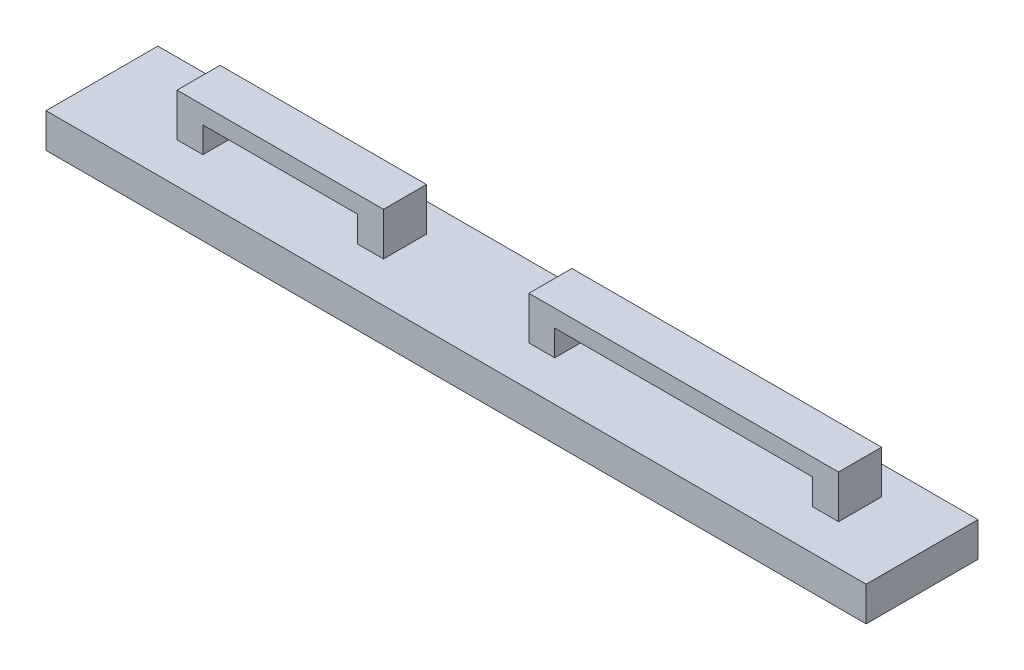
ISO-10303-21;
HEADER;
FILE_DESCRIPTION(('STEP AP214'),'2;1');
FILE_NAME('part.step','',(''),(''),'','','');
FILE_SCHEMA(('AUTOMOTIVE_DESIGN { 1 0 10303 214 1 1 1 1 }'));
ENDSEC;
DATA;
#1=APPLICATION_CONTEXT('core data for automotive mechanical design processes');
#2=APPLICATION_PROTOCOL_DEFINITION('international standard','automotive_design',2000,#1);
#3=PRODUCT_CONTEXT('',#1,'mechanical');
#4=PRODUCT('Part','Part','',(#3));
#5=PRODUCT_RELATED_PRODUCT_CATEGORY('part','',(#4));
#6=PRODUCT_DEFINITION_FORMATION('','',#4);
#7=PRODUCT_DEFINITION_CONTEXT('part definition',#1,'design');
#8=PRODUCT_DEFINITION('design','',#6,#7);
#9=PRODUCT_DEFINITION_SHAPE('','',#8);
#10=(LENGTH_UNIT() NAMED_UNIT(*) SI_UNIT(.MILLI.,.METRE.));
#11=(NAMED_UNIT(*) PLANE_ANGLE_UNIT() SI_UNIT($,.RADIAN.));
#12=(NAMED_UNIT(*) SI_UNIT($,.STERADIAN.) SOLID_ANGLE_UNIT());
#13=UNCERTAINTY_MEASURE_WITH_UNIT(LENGTH_MEASURE(1.E-05),#10,'distance_accuracy_value','');
#14=(GEOMETRIC_REPRESENTATION_CONTEXT(3) GLOBAL_UNCERTAINTY_ASSIGNED_CONTEXT((#13)) GLOBAL_UNIT_ASSIGNED_CONTEXT((#10,
#11,#12)) REPRESENTATION_CONTEXT('',''));
#15=CARTESIAN_POINT('',(0.,0.,0.));
#16=DIRECTION('',(0.,0.,1.));
#17=DIRECTION('',(1.,0.,0.));
#18=AXIS2_PLACEMENT_3D('',#15,#16,#17);
#19=CARTESIAN_POINT('',(0.,2.,0.));
#20=DIRECTION('',(0.,1.,0.));
#21=DIRECTION('',(0.,0.,1.));
#22=AXIS2_PLACEMENT_3D('',#19,#20,#21);
#23=PLANE('',#22);
#24=DIRECTION('',(1.,0.,0.));
#25=VECTOR('',#24,1.);
#26=CARTESIAN_POINT('',(-23.8392418824722,2.,0.));
#27=LINE('',#26,#25);
#28=CARTESIAN_POINT('',(-23.8392418824722,2.,0.));
#29=VERTEX_POINT('',#28);
#30=CARTESIAN_POINT('',(23.8392418824722,2.,0.));
#31=VERTEX_POINT('',#30);
#32=EDGE_CURVE('E180',#29,#31,#27,.T.);
#33=ORIENTED_EDGE('',*,*,#32,.F.);
#34=DIRECTION('',(0.,0.,1.));
#35=VECTOR('',#34,1.);
#36=CARTESIAN_POINT('',(-23.8392418824722,2.,-6.50216160924183));
#37=LINE('',#36,#35);
#38=CARTESIAN_POINT('',(-23.8392418824722,2.,6.50216160924183));
#39=VERTEX_POINT('',#38);
#40=EDGE_CURVE('E187',#29,#39,#37,.T.);
#41=ORIENTED_EDGE('',*,*,#40,.T.);
#42=DIRECTION('',(1.,0.,0.));
#43=VECTOR('',#42,1.);
#44=CARTESIAN_POINT('',(-23.8392418824722,2.,6.50216160924183));
#45=LINE('',#44,#43);
#46=CARTESIAN_POINT('',(23.8392418824722,2.,6.50216160924183));
#47=VERTEX_POINT('',#46);
#48=EDGE_CURVE('E200',#39,#47,#45,.T.);
#49=ORIENTED_EDGE('',*,*,#48,.T.);
#50=DIRECTION('',(0.,0.,-1.));
#51=VECTOR('',#50,1.);
#52=CARTESIAN_POINT('',(23.8392418824722,2.,-6.50216160924183));
#53=LINE('',#52,#51);
#54=EDGE_CURVE('E194',#47,#31,#53,.T.);
#55=ORIENTED_EDGE('',*,*,#54,.T.);
#56=EDGE_LOOP('',(#33,#41,#49,#55));
#57=FACE_BOUND('',#56,.T.);
#58=DIRECTION('',(-1.,0.,0.));
#59=VECTOR('',#58,1.);
#60=CARTESIAN_POINT('',(-18.5640283455676,2.,1.65860922456916));
#61=LINE('',#60,#59);
#62=CARTESIAN_POINT('',(-17.0640283455676,2.,1.65860922456916));
#63=VERTEX_POINT('',#62);
#64=CARTESIAN_POINT('',(-18.5640283455676,2.,1.65860922456916));
#65=VERTEX_POINT('',#64);
#66=EDGE_CURVE('E225',#63,#65,#61,.T.);
#67=ORIENTED_EDGE('',*,*,#66,.F.);
#68=DIRECTION('',(0.,0.,-1.));
#69=VECTOR('',#68,1.);
#70=CARTESIAN_POINT('',(-17.0640283455676,2.,1.65860922456916));
#71=LINE('',#70,#69);
#72=CARTESIAN_POINT('',(-17.0640283455676,2.,4.15860922456916));
#73=VERTEX_POINT('',#72);
#74=EDGE_CURVE('E227',#73,#63,#71,.T.);
#75=ORIENTED_EDGE('',*,*,#74,.F.);
#76=DIRECTION('',(1.,0.,0.));
#77=VECTOR('',#76,1.);
#78=CARTESIAN_POINT('',(-18.5640283455676,2.,4.15860922456916));
#79=LINE('',#78,#77);
#80=CARTESIAN_POINT('',(-18.5640283455676,2.,4.15860922456916));
#81=VERTEX_POINT('',#80);
#82=EDGE_CURVE('E220',#81,#73,#79,.T.);
#83=ORIENTED_EDGE('',*,*,#82,.F.);
#84=DIRECTION('',(0.,0.,1.));
#85=VECTOR('',#84,1.);
#86=CARTESIAN_POINT('',(-18.5640283455676,2.,1.65860922456916));
#87=LINE('',#86,#85);
#88=EDGE_CURVE('E222',#65,#81,#87,.T.);
#89=ORIENTED_EDGE('',*,*,#88,.F.);
#90=EDGE_LOOP('',(#67,#75,#83,#89));
#91=FACE_BOUND('',#90,.T.);
#92=DIRECTION('',(1.,0.,0.));
#93=VECTOR('',#92,1.);
#94=CARTESIAN_POINT('',(-8.06402834556756,2.,4.15860922456916));
#95=LINE('',#94,#93);
#96=CARTESIAN_POINT('',(-8.06402834556756,2.,4.15860922456916));
#97=VERTEX_POINT('',#96);
#98=CARTESIAN_POINT('',(-6.56402834556753,2.,4.15860922456916));
#99=VERTEX_POINT('',#98);
#100=EDGE_CURVE('E240',#97,#99,#95,.T.);
#101=ORIENTED_EDGE('',*,*,#100,.F.);
#102=DIRECTION('',(0.,0.,1.));
#103=VECTOR('',#102,1.);
#104=CARTESIAN_POINT('',(-8.06402834556756,2.,1.65860922456916));
#105=LINE('',#104,#103);
#106=CARTESIAN_POINT('',(-8.06402834556756,2.,1.65860922456916));
#107=VERTEX_POINT('',#106);
#108=EDGE_CURVE('E230',#107,#97,#105,.T.);
#109=ORIENTED_EDGE('',*,*,#108,.F.);
#110=DIRECTION('',(-1.,0.,0.));
#111=VECTOR('',#110,1.);
#112=CARTESIAN_POINT('',(-8.06402834556756,2.,1.65860922456916));
#113=LINE('',#112,#111);
#114=CARTESIAN_POINT('',(-6.56402834556756,2.,1.65860922456916));
#115=VERTEX_POINT('',#114);
#116=EDGE_CURVE('E236',#115,#107,#113,.T.);
#117=ORIENTED_EDGE('',*,*,#116,.F.);
#118=DIRECTION('',(0.,0.,-1.));
#119=VECTOR('',#118,1.);
#120=CARTESIAN_POINT('',(-6.56402834556756,2.,1.65860922456916));
#121=LINE('',#120,#119);
#122=EDGE_CURVE('E242',#99,#115,#121,.T.);
#123=ORIENTED_EDGE('',*,*,#122,.F.);
#124=EDGE_LOOP('',(#101,#109,#117,#123));
#125=FACE_BOUND('',#124,.T.);
#126=DIRECTION('',(1.,0.,0.));
#127=VECTOR('',#126,1.);
#128=CARTESIAN_POINT('',(1.89101271490993,2.,4.15860922456916));
#129=LINE('',#128,#127);
#130=CARTESIAN_POINT('',(1.89101271490993,2.,4.15860922456916));
#131=VERTEX_POINT('',#130);
#132=CARTESIAN_POINT('',(3.39101271490993,2.,4.15860922456916));
#133=VERTEX_POINT('',#132);
#134=EDGE_CURVE('E263',#131,#133,#129,.T.);
#135=ORIENTED_EDGE('',*,*,#134,.F.);
#136=DIRECTION('',(0.,0.,1.));
#137=VECTOR('',#136,1.);
#138=CARTESIAN_POINT('',(1.89101271490993,2.,1.65860922456916));
#139=LINE('',#138,#137);
#140=CARTESIAN_POINT('',(1.89101271490993,2.,1.65860922456916));
#141=VERTEX_POINT('',#140);
#142=EDGE_CURVE('E255',#141,#131,#139,.T.);
#143=ORIENTED_EDGE('',*,*,#142,.F.);
#144=DIRECTION('',(-1.,0.,0.));
#145=VECTOR('',#144,1.);
#146=CARTESIAN_POINT('',(1.89101271490993,2.,1.65860922456916));
#147=LINE('',#146,#145);
#148=CARTESIAN_POINT('',(3.39101271490993,2.,1.65860922456916));
#149=VERTEX_POINT('',#148);
#150=EDGE_CURVE('E259',#149,#141,#147,.T.);
#151=ORIENTED_EDGE('',*,*,#150,.F.);
#152=DIRECTION('',(0.,0.,-1.));
#153=VECTOR('',#152,1.);
#154=CARTESIAN_POINT('',(3.39101271490993,2.,1.65860922456916));
#155=LINE('',#154,#153);
#156=EDGE_CURVE('E265',#133,#149,#155,.T.);
#157=ORIENTED_EDGE('',*,*,#156,.F.);
#158=EDGE_LOOP('',(#135,#143,#151,#157));
#159=FACE_BOUND('',#158,.T.);
#160=DIRECTION('',(1.,0.,0.));
#161=VECTOR('',#160,1.);
#162=CARTESIAN_POINT('',(18.3910127149099,2.,4.15860922456916));
#163=LINE('',#162,#161);
#164=CARTESIAN_POINT('',(18.3910127149099,2.,4.15860922456916));
#165=VERTEX_POINT('',#164);
#166=CARTESIAN_POINT('',(19.8910127149099,2.,4.15860922456916));
#167=VERTEX_POINT('',#166);
#168=EDGE_CURVE('E286',#165,#167,#163,.T.);
#169=ORIENTED_EDGE('',*,*,#168,.F.);
#170=DIRECTION('',(0.,0.,1.));
#171=VECTOR('',#170,1.);
#172=CARTESIAN_POINT('',(18.3910127149099,2.,1.65860922456916));
#173=LINE('',#172,#171);
#174=CARTESIAN_POINT('',(18.3910127149099,2.,1.65860922456916));
#175=VERTEX_POINT('',#174);
#176=EDGE_CURVE('E278',#175,#165,#173,.T.);
#177=ORIENTED_EDGE('',*,*,#176,.F.);
#178=DIRECTION('',(-1.,0.,0.));
#179=VECTOR('',#178,1.);
#180=CARTESIAN_POINT('',(18.3910127149099,2.,1.65860922456916));
#181=LINE('',#180,#179);
#182=CARTESIAN_POINT('',(19.8910127149099,2.,1.65860922456916));
#183=VERTEX_POINT('',#182);
#184=EDGE_CURVE('E282',#183,#175,#181,.T.);
#185=ORIENTED_EDGE('',*,*,#184,.F.);
#186=DIRECTION('',(0.,0.,-1.));
#187=VECTOR('',#186,1.);
#188=CARTESIAN_POINT('',(19.8910127149099,2.,1.65860922456916));
#189=LINE('',#188,#187);
#190=EDGE_CURVE('E288',#167,#183,#189,.T.);
#191=ORIENTED_EDGE('',*,*,#190,.F.);
#192=EDGE_LOOP('',(#169,#177,#185,#191));
#193=FACE_BOUND('',#192,.T.);
#194=ADVANCED_FACE('F37',(#57,#91,#125,#159,#193),#23,.T.);
#195=CARTESIAN_POINT('',(23.8392418824722,2.,-6.50216160924183));
#196=DIRECTION('',(-1.,0.,0.));
#197=DIRECTION('',(0.,0.,1.));
#198=AXIS2_PLACEMENT_3D('',#195,#196,#197);
#199=PLANE('',#198);
#200=DIRECTION('',(0.,0.,-1.));
#201=VECTOR('',#200,1.);
#202=CARTESIAN_POINT('',(23.8392418824722,0.,-6.50216160924183));
#203=LINE('',#202,#201);
#204=CARTESIAN_POINT('',(23.8392418824722,0.,6.50216160924183));
#205=VERTEX_POINT('',#204);
#206=CARTESIAN_POINT('',(23.8392418824722,0.,0.));
#207=VERTEX_POINT('',#206);
#208=EDGE_CURVE('E192',#205,#207,#203,.T.);
#209=ORIENTED_EDGE('',*,*,#208,.T.);
#210=DIRECTION('',(0.,1.,0.));
#211=VECTOR('',#210,1.);
#212=CARTESIAN_POINT('',(23.8392418824722,0.,0.));
#213=LINE('',#212,#211);
#214=EDGE_CURVE('E52',#207,#31,#213,.T.);
#215=ORIENTED_EDGE('',*,*,#214,.T.);
#216=ORIENTED_EDGE('',*,*,#54,.F.);
#217=DIRECTION('',(0.,-1.,0.));
#218=VECTOR('',#217,1.);
#219=CARTESIAN_POINT('',(23.8392418824722,2.,6.50216160924183));
#220=LINE('',#219,#218);
#221=EDGE_CURVE('E45',#47,#205,#220,.T.);
#222=ORIENTED_EDGE('',*,*,#221,.T.);
#223=EDGE_LOOP('',(#209,#215,#216,#222));
#224=FACE_BOUND('',#223,.T.);
#225=ADVANCED_FACE('F39',(#224),#199,.F.);
#226=CARTESIAN_POINT('',(-23.8392418824722,2.,-6.50216160924183));
#227=DIRECTION('',(1.,0.,0.));
#228=DIRECTION('',(0.,0.,-1.));
#229=AXIS2_PLACEMENT_3D('',#226,#227,#228);
#230=PLANE('',#229);
#231=ORIENTED_EDGE('',*,*,#40,.F.);
#232=DIRECTION('',(0.,1.,0.));
#233=VECTOR('',#232,1.);
#234=CARTESIAN_POINT('',(-23.8392418824722,0.,0.));
#235=LINE('',#234,#233);
#236=CARTESIAN_POINT('',(-23.8392418824722,0.,0.));
#237=VERTEX_POINT('',#236);
#238=EDGE_CURVE('E174',#237,#29,#235,.T.);
#239=ORIENTED_EDGE('',*,*,#238,.F.);
#240=DIRECTION('',(0.,0.,1.));
#241=VECTOR('',#240,1.);
#242=CARTESIAN_POINT('',(-23.8392418824722,0.,-6.50216160924183));
#243=LINE('',#242,#241);
#244=CARTESIAN_POINT('',(-23.8392418824722,0.,6.50216160924183));
#245=VERTEX_POINT('',#244);
#246=EDGE_CURVE('E186',#237,#245,#243,.T.);
#247=ORIENTED_EDGE('',*,*,#246,.T.);
#248=DIRECTION('',(0.,-1.,0.));
#249=VECTOR('',#248,1.);
#250=CARTESIAN_POINT('',(-23.8392418824722,2.,6.50216160924183));
#251=LINE('',#250,#249);
#252=EDGE_CURVE('E11',#39,#245,#251,.T.);
#253=ORIENTED_EDGE('',*,*,#252,.F.);
#254=EDGE_LOOP('',(#231,#239,#247,#253));
#255=FACE_BOUND('',#254,.T.);
#256=ADVANCED_FACE('F184',(#255),#230,.F.);
#257=CARTESIAN_POINT('',(-23.8392418824722,2.,6.50216160924183));
#258=DIRECTION('',(0.,0.,-1.));
#259=DIRECTION('',(-1.,0.,0.));
#260=AXIS2_PLACEMENT_3D('',#257,#258,#259);
#261=PLANE('',#260);
#262=DIRECTION('',(1.,0.,0.));
#263=VECTOR('',#262,1.);
#264=CARTESIAN_POINT('',(-23.8392418824722,0.,6.50216160924183));
#265=LINE('',#264,#263);
#266=EDGE_CURVE('E191',#245,#205,#265,.T.);
#267=ORIENTED_EDGE('',*,*,#266,.T.);
#268=ORIENTED_EDGE('',*,*,#221,.F.);
#269=ORIENTED_EDGE('',*,*,#48,.F.);
#270=ORIENTED_EDGE('',*,*,#252,.T.);
#271=EDGE_LOOP('',(#267,#268,#269,#270));
#272=FACE_BOUND('',#271,.T.);
#273=ADVANCED_FACE('F422',(#272),#261,.F.);
#274=CARTESIAN_POINT('',(0.,0.,0.));
#275=DIRECTION('',(0.,1.,0.));
#276=DIRECTION('',(0.,0.,1.));
#277=AXIS2_PLACEMENT_3D('',#274,#275,#276);
#278=PLANE('',#277);
#279=ORIENTED_EDGE('',*,*,#246,.F.);
#280=DIRECTION('',(1.,0.,0.));
#281=VECTOR('',#280,1.);
#282=CARTESIAN_POINT('',(-23.8392418824722,0.,0.));
#283=LINE('',#282,#281);
#284=EDGE_CURVE('E171',#237,#207,#283,.T.);
#285=ORIENTED_EDGE('',*,*,#284,.T.);
#286=ORIENTED_EDGE('',*,*,#208,.F.);
#287=ORIENTED_EDGE('',*,*,#266,.F.);
#288=EDGE_LOOP('',(#279,#285,#286,#287));
#289=FACE_BOUND('',#288,.T.);
#290=ADVANCED_FACE('F190',(#289),#278,.F.);
#291=CARTESIAN_POINT('',(-17.0640283455676,3.5,1.65860922456916));
#292=DIRECTION('',(-1.,0.,0.));
#293=DIRECTION('',(0.,0.,1.));
#294=AXIS2_PLACEMENT_3D('',#291,#292,#293);
#295=PLANE('',#294);
#296=ORIENTED_EDGE('',*,*,#74,.T.);
#297=DIRECTION('',(0.,-1.,0.));
#298=VECTOR('',#297,1.);
#299=CARTESIAN_POINT('',(-17.0640283455676,3.5,1.65860922456916));
#300=LINE('',#299,#298);
#301=CARTESIAN_POINT('',(-17.0640283455676,3.5,1.65860922456916));
#302=VERTEX_POINT('',#301);
#303=EDGE_CURVE('E196',#302,#63,#300,.T.);
#304=ORIENTED_EDGE('',*,*,#303,.F.);
#305=DIRECTION('',(0.,0.,-1.));
#306=VECTOR('',#305,1.);
#307=CARTESIAN_POINT('',(-17.0640283455676,3.5,1.65860922456916));
#308=LINE('',#307,#306);
#309=CARTESIAN_POINT('',(-17.0640283455676,3.5,4.15860922456916));
#310=VERTEX_POINT('',#309);
#311=EDGE_CURVE('E219',#310,#302,#308,.T.);
#312=ORIENTED_EDGE('',*,*,#311,.F.);
#313=DIRECTION('',(0.,-1.,0.));
#314=VECTOR('',#313,1.);
#315=CARTESIAN_POINT('',(-17.0640283455676,3.5,4.15860922456916));
#316=LINE('',#315,#314);
#317=EDGE_CURVE('E216',#310,#73,#316,.T.);
#318=ORIENTED_EDGE('',*,*,#317,.T.);
#319=EDGE_LOOP('',(#296,#304,#312,#318));
#320=FACE_BOUND('',#319,.T.);
#321=ADVANCED_FACE('F415',(#320),#295,.F.);
#322=CARTESIAN_POINT('',(-18.5640283455676,3.5,1.65860922456916));
#323=DIRECTION('',(0.,0.,1.));
#324=DIRECTION('',(1.,0.,0.));
#325=AXIS2_PLACEMENT_3D('',#322,#323,#324);
#326=PLANE('',#325);
#327=ORIENTED_EDGE('',*,*,#66,.T.);
#328=DIRECTION('',(0.,-1.,0.));
#329=VECTOR('',#328,1.);
#330=CARTESIAN_POINT('',(-18.5640283455676,3.5,1.65860922456916));
#331=LINE('',#330,#329);
#332=CARTESIAN_POINT('',(-18.5640283455676,4.5,1.65860922456916));
#333=VERTEX_POINT('',#332);
#334=EDGE_CURVE('E211',#333,#65,#331,.T.);
#335=ORIENTED_EDGE('',*,*,#334,.F.);
#336=DIRECTION('',(-1.,0.,0.));
#337=VECTOR('',#336,1.);
#338=CARTESIAN_POINT('',(-18.5640283455676,4.5,1.65860922456916));
#339=LINE('',#338,#337);
#340=CARTESIAN_POINT('',(-6.56402834556753,4.5,1.65860922456916));
#341=VERTEX_POINT('',#340);
#342=EDGE_CURVE('E299',#341,#333,#339,.T.);
#343=ORIENTED_EDGE('',*,*,#342,.F.);
#344=DIRECTION('',(0.,-1.,0.));
#345=VECTOR('',#344,1.);
#346=CARTESIAN_POINT('',(-6.56402834556756,3.5,1.65860922456916));
#347=LINE('',#346,#345);
#348=EDGE_CURVE('E248',#341,#115,#347,.T.);
#349=ORIENTED_EDGE('',*,*,#348,.T.);
#350=ORIENTED_EDGE('',*,*,#116,.T.);
#351=DIRECTION('',(0.,-1.,0.));
#352=VECTOR('',#351,1.);
#353=CARTESIAN_POINT('',(-8.06402834556756,3.5,1.65860922456916));
#354=LINE('',#353,#352);
#355=CARTESIAN_POINT('',(-8.06402834556756,3.5,1.65860922456916));
#356=VERTEX_POINT('',#355);
#357=EDGE_CURVE('E237',#356,#107,#354,.T.);
#358=ORIENTED_EDGE('',*,*,#357,.F.);
#359=DIRECTION('',(-1.,0.,0.));
#360=VECTOR('',#359,1.);
#361=CARTESIAN_POINT('',(-18.5640283455676,3.5,1.65860922456916));
#362=LINE('',#361,#360);
#363=EDGE_CURVE('E300',#356,#302,#362,.T.);
#364=ORIENTED_EDGE('',*,*,#363,.T.);
#365=ORIENTED_EDGE('',*,*,#303,.T.);
#366=EDGE_LOOP('',(#327,#335,#343,#349,#350,#358,#364,#365));
#367=FACE_BOUND('',#366,.T.);
#368=ADVANCED_FACE('F411',(#367),#326,.F.);
#369=CARTESIAN_POINT('',(-18.5640283455676,3.5,1.65860922456916));
#370=DIRECTION('',(1.,0.,0.));
#371=DIRECTION('',(0.,0.,-1.));
#372=AXIS2_PLACEMENT_3D('',#369,#370,#371);
#373=PLANE('',#372);
#374=ORIENTED_EDGE('',*,*,#88,.T.);
#375=DIRECTION('',(0.,-1.,0.));
#376=VECTOR('',#375,1.);
#377=CARTESIAN_POINT('',(-18.5640283455676,3.5,4.15860922456916));
#378=LINE('',#377,#376);
#379=CARTESIAN_POINT('',(-18.5640283455676,4.5,4.15860922456916));
#380=VERTEX_POINT('',#379);
#381=EDGE_CURVE('E214',#380,#81,#378,.T.);
#382=ORIENTED_EDGE('',*,*,#381,.F.);
#383=DIRECTION('',(0.,0.,1.));
#384=VECTOR('',#383,1.);
#385=CARTESIAN_POINT('',(-18.5640283455676,4.5,1.65860922456916));
#386=LINE('',#385,#384);
#387=EDGE_CURVE('E303',#333,#380,#386,.T.);
#388=ORIENTED_EDGE('',*,*,#387,.F.);
#389=ORIENTED_EDGE('',*,*,#334,.T.);
#390=EDGE_LOOP('',(#374,#382,#388,#389));
#391=FACE_BOUND('',#390,.T.);
#392=ADVANCED_FACE('F407',(#391),#373,.F.);
#393=CARTESIAN_POINT('',(-18.5640283455676,3.5,4.15860922456916));
#394=DIRECTION('',(0.,0.,-1.));
#395=DIRECTION('',(-1.,0.,0.));
#396=AXIS2_PLACEMENT_3D('',#393,#394,#395);
#397=PLANE('',#396);
#398=ORIENTED_EDGE('',*,*,#82,.T.);
#399=ORIENTED_EDGE('',*,*,#317,.F.);
#400=DIRECTION('',(1.,0.,0.));
#401=VECTOR('',#400,1.);
#402=CARTESIAN_POINT('',(-18.5640283455676,3.5,4.15860922456916));
#403=LINE('',#402,#401);
#404=CARTESIAN_POINT('',(-8.06402834556756,3.5,4.15860922456916));
#405=VERTEX_POINT('',#404);
#406=EDGE_CURVE('E304',#310,#405,#403,.T.);
#407=ORIENTED_EDGE('',*,*,#406,.T.);
#408=DIRECTION('',(0.,-1.,0.));
#409=VECTOR('',#408,1.);
#410=CARTESIAN_POINT('',(-8.06402834556756,3.5,4.15860922456916));
#411=LINE('',#410,#409);
#412=EDGE_CURVE('E253',#405,#97,#411,.T.);
#413=ORIENTED_EDGE('',*,*,#412,.T.);
#414=ORIENTED_EDGE('',*,*,#100,.T.);
#415=DIRECTION('',(0.,-1.,0.));
#416=VECTOR('',#415,1.);
#417=CARTESIAN_POINT('',(-6.56402834556753,3.5,4.15860922456916));
#418=LINE('',#417,#416);
#419=CARTESIAN_POINT('',(-6.56402834556753,4.5,4.15860922456916));
#420=VERTEX_POINT('',#419);
#421=EDGE_CURVE('E250',#420,#99,#418,.T.);
#422=ORIENTED_EDGE('',*,*,#421,.F.);
#423=DIRECTION('',(1.,0.,0.));
#424=VECTOR('',#423,1.);
#425=CARTESIAN_POINT('',(-18.5640283455676,4.5,4.15860922456916));
#426=LINE('',#425,#424);
#427=EDGE_CURVE('E313',#380,#420,#426,.T.);
#428=ORIENTED_EDGE('',*,*,#427,.F.);
#429=ORIENTED_EDGE('',*,*,#381,.T.);
#430=EDGE_LOOP('',(#398,#399,#407,#413,#414,#422,#428,#429));
#431=FACE_BOUND('',#430,.T.);
#432=ADVANCED_FACE('F400',(#431),#397,.F.);
#433=CARTESIAN_POINT('',(-8.06402834556756,3.5,1.65860922456916));
#434=DIRECTION('',(1.,0.,0.));
#435=DIRECTION('',(0.,0.,-1.));
#436=AXIS2_PLACEMENT_3D('',#433,#434,#435);
#437=PLANE('',#436);
#438=ORIENTED_EDGE('',*,*,#108,.T.);
#439=ORIENTED_EDGE('',*,*,#412,.F.);
#440=DIRECTION('',(0.,0.,1.));
#441=VECTOR('',#440,1.);
#442=CARTESIAN_POINT('',(-8.06402834556756,3.5,1.65860922456916));
#443=LINE('',#442,#441);
#444=EDGE_CURVE('E233',#356,#405,#443,.T.);
#445=ORIENTED_EDGE('',*,*,#444,.F.);
#446=ORIENTED_EDGE('',*,*,#357,.T.);
#447=EDGE_LOOP('',(#438,#439,#445,#446));
#448=FACE_BOUND('',#447,.T.);
#449=ADVANCED_FACE('F397',(#448),#437,.F.);
#450=CARTESIAN_POINT('',(-6.56402834556756,3.5,1.65860922456916));
#451=DIRECTION('',(-1.,0.,0.));
#452=DIRECTION('',(0.,0.,1.));
#453=AXIS2_PLACEMENT_3D('',#450,#451,#452);
#454=PLANE('',#453);
#455=ORIENTED_EDGE('',*,*,#122,.T.);
#456=ORIENTED_EDGE('',*,*,#348,.F.);
#457=DIRECTION('',(0.,0.,-1.));
#458=VECTOR('',#457,1.);
#459=CARTESIAN_POINT('',(-6.56402834556753,4.5,1.65860922456916));
#460=LINE('',#459,#458);
#461=EDGE_CURVE('E310',#420,#341,#460,.T.);
#462=ORIENTED_EDGE('',*,*,#461,.F.);
#463=ORIENTED_EDGE('',*,*,#421,.T.);
#464=EDGE_LOOP('',(#455,#456,#462,#463));
#465=FACE_BOUND('',#464,.T.);
#466=ADVANCED_FACE('F392',(#465),#454,.F.);
#467=CARTESIAN_POINT('',(1.89101271490993,3.5,1.65860922456916));
#468=DIRECTION('',(1.,0.,0.));
#469=DIRECTION('',(0.,0.,-1.));
#470=AXIS2_PLACEMENT_3D('',#467,#468,#469);
#471=PLANE('',#470);
#472=ORIENTED_EDGE('',*,*,#142,.T.);
#473=DIRECTION('',(0.,-1.,0.));
#474=VECTOR('',#473,1.);
#475=CARTESIAN_POINT('',(1.89101271490993,3.5,4.15860922456916));
#476=LINE('',#475,#474);
#477=CARTESIAN_POINT('',(1.89101271490993,4.5,4.15860922456916));
#478=VERTEX_POINT('',#477);
#479=EDGE_CURVE('E276',#478,#131,#476,.T.);
#480=ORIENTED_EDGE('',*,*,#479,.F.);
#481=DIRECTION('',(0.,0.,1.));
#482=VECTOR('',#481,1.);
#483=CARTESIAN_POINT('',(1.89101271490993,4.5,1.65860922456916));
#484=LINE('',#483,#482);
#485=CARTESIAN_POINT('',(1.89101271490993,4.5,1.65860922456916));
#486=VERTEX_POINT('',#485);
#487=EDGE_CURVE('E318',#486,#478,#484,.T.);
#488=ORIENTED_EDGE('',*,*,#487,.F.);
#489=DIRECTION('',(0.,-1.,0.));
#490=VECTOR('',#489,1.);
#491=CARTESIAN_POINT('',(1.89101271490993,3.5,1.65860922456916));
#492=LINE('',#491,#490);
#493=EDGE_CURVE('E260',#486,#141,#492,.T.);
#494=ORIENTED_EDGE('',*,*,#493,.T.);
#495=EDGE_LOOP('',(#472,#480,#488,#494));
#496=FACE_BOUND('',#495,.T.);
#497=ADVANCED_FACE('F367',(#496),#471,.F.);
#498=CARTESIAN_POINT('',(1.89101271490993,3.5,4.15860922456916));
#499=DIRECTION('',(0.,0.,-1.));
#500=DIRECTION('',(-1.,0.,0.));
#501=AXIS2_PLACEMENT_3D('',#498,#499,#500);
#502=PLANE('',#501);
#503=ORIENTED_EDGE('',*,*,#134,.T.);
#504=DIRECTION('',(0.,-1.,0.));
#505=VECTOR('',#504,1.);
#506=CARTESIAN_POINT('',(3.39101271490993,3.5,4.15860922456916));
#507=LINE('',#506,#505);
#508=CARTESIAN_POINT('',(3.39101271490993,3.5,4.15860922456916));
#509=VERTEX_POINT('',#508);
#510=EDGE_CURVE('E273',#509,#133,#507,.T.);
#511=ORIENTED_EDGE('',*,*,#510,.F.);
#512=DIRECTION('',(1.,0.,0.));
#513=VECTOR('',#512,1.);
#514=CARTESIAN_POINT('',(1.89101271490993,3.5,4.15860922456916));
#515=LINE('',#514,#513);
#516=CARTESIAN_POINT('',(18.3910127149099,3.5,4.15860922456916));
#517=VERTEX_POINT('',#516);
#518=EDGE_CURVE('E307',#509,#517,#515,.T.);
#519=ORIENTED_EDGE('',*,*,#518,.T.);
#520=DIRECTION('',(0.,-1.,0.));
#521=VECTOR('',#520,1.);
#522=CARTESIAN_POINT('',(18.3910127149099,3.5,4.15860922456916));
#523=LINE('',#522,#521);
#524=EDGE_CURVE('E297',#517,#165,#523,.T.);
#525=ORIENTED_EDGE('',*,*,#524,.T.);
#526=ORIENTED_EDGE('',*,*,#168,.T.);
#527=DIRECTION('',(0.,-1.,0.));
#528=VECTOR('',#527,1.);
#529=CARTESIAN_POINT('',(19.8910127149099,3.5,4.15860922456916));
#530=LINE('',#529,#528);
#531=CARTESIAN_POINT('',(19.8910127149099,4.5,4.15860922456916));
#532=VERTEX_POINT('',#531);
#533=EDGE_CURVE('E294',#532,#167,#530,.T.);
#534=ORIENTED_EDGE('',*,*,#533,.F.);
#535=DIRECTION('',(1.,0.,0.));
#536=VECTOR('',#535,1.);
#537=CARTESIAN_POINT('',(1.89101271490993,4.5,4.15860922456916));
#538=LINE('',#537,#536);
#539=EDGE_CURVE('E322',#478,#532,#538,.T.);
#540=ORIENTED_EDGE('',*,*,#539,.F.);
#541=ORIENTED_EDGE('',*,*,#479,.T.);
#542=EDGE_LOOP('',(#503,#511,#519,#525,#526,#534,#540,#541));
#543=FACE_BOUND('',#542,.T.);
#544=ADVANCED_FACE('F356',(#543),#502,.F.);
#545=CARTESIAN_POINT('',(3.39101271490993,3.5,1.65860922456916));
#546=DIRECTION('',(-1.,0.,0.));
#547=DIRECTION('',(0.,0.,1.));
#548=AXIS2_PLACEMENT_3D('',#545,#546,#547);
#549=PLANE('',#548);
#550=ORIENTED_EDGE('',*,*,#156,.T.);
#551=DIRECTION('',(0.,-1.,0.));
#552=VECTOR('',#551,1.);
#553=CARTESIAN_POINT('',(3.39101271490993,3.5,1.65860922456916));
#554=LINE('',#553,#552);
#555=CARTESIAN_POINT('',(3.39101271490993,3.5,1.65860922456916));
#556=VERTEX_POINT('',#555);
#557=EDGE_CURVE('E271',#556,#149,#554,.T.);
#558=ORIENTED_EDGE('',*,*,#557,.F.);
#559=DIRECTION('',(0.,0.,-1.));
#560=VECTOR('',#559,1.);
#561=CARTESIAN_POINT('',(3.39101271490993,3.5,1.65860922456916));
#562=LINE('',#561,#560);
#563=EDGE_CURVE('E256',#509,#556,#562,.T.);
#564=ORIENTED_EDGE('',*,*,#563,.F.);
#565=ORIENTED_EDGE('',*,*,#510,.T.);
#566=EDGE_LOOP('',(#550,#558,#564,#565));
#567=FACE_BOUND('',#566,.T.);
#568=ADVANCED_FACE('F369',(#567),#549,.F.);
#569=CARTESIAN_POINT('',(1.89101271490993,3.5,1.65860922456916));
#570=DIRECTION('',(0.,0.,1.));
#571=DIRECTION('',(1.,0.,0.));
#572=AXIS2_PLACEMENT_3D('',#569,#570,#571);
#573=PLANE('',#572);
#574=ORIENTED_EDGE('',*,*,#150,.T.);
#575=ORIENTED_EDGE('',*,*,#493,.F.);
#576=DIRECTION('',(-1.,0.,0.));
#577=VECTOR('',#576,1.);
#578=CARTESIAN_POINT('',(1.89101271490993,4.5,1.65860922456916));
#579=LINE('',#578,#577);
#580=CARTESIAN_POINT('',(19.8910127149099,4.5,1.65860922456916));
#581=VERTEX_POINT('',#580);
#582=EDGE_CURVE('E328',#581,#486,#579,.T.);
#583=ORIENTED_EDGE('',*,*,#582,.F.);
#584=DIRECTION('',(0.,-1.,0.));
#585=VECTOR('',#584,1.);
#586=CARTESIAN_POINT('',(19.8910127149099,3.5,1.65860922456916));
#587=LINE('',#586,#585);
#588=EDGE_CURVE('E60',#581,#183,#587,.T.);
#589=ORIENTED_EDGE('',*,*,#588,.T.);
#590=ORIENTED_EDGE('',*,*,#184,.T.);
#591=DIRECTION('',(0.,-1.,0.));
#592=VECTOR('',#591,1.);
#593=CARTESIAN_POINT('',(18.3910127149099,3.5,1.65860922456916));
#594=LINE('',#593,#592);
#595=CARTESIAN_POINT('',(18.3910127149099,3.5,1.65860922456916));
#596=VERTEX_POINT('',#595);
#597=EDGE_CURVE('E283',#596,#175,#594,.T.);
#598=ORIENTED_EDGE('',*,*,#597,.F.);
#599=DIRECTION('',(-1.,0.,0.));
#600=VECTOR('',#599,1.);
#601=CARTESIAN_POINT('',(1.89101271490993,3.5,1.65860922456916));
#602=LINE('',#601,#600);
#603=EDGE_CURVE('E321',#596,#556,#602,.T.);
#604=ORIENTED_EDGE('',*,*,#603,.T.);
#605=ORIENTED_EDGE('',*,*,#557,.T.);
#606=EDGE_LOOP('',(#574,#575,#583,#589,#590,#598,#604,#605));
#607=FACE_BOUND('',#606,.T.);
#608=ADVANCED_FACE('F364',(#607),#573,.F.);
#609=CARTESIAN_POINT('',(18.3910127149099,3.5,1.65860922456916));
#610=DIRECTION('',(1.,0.,0.));
#611=DIRECTION('',(0.,0.,-1.));
#612=AXIS2_PLACEMENT_3D('',#609,#610,#611);
#613=PLANE('',#612);
#614=ORIENTED_EDGE('',*,*,#176,.T.);
#615=ORIENTED_EDGE('',*,*,#524,.F.);
#616=DIRECTION('',(0.,0.,1.));
#617=VECTOR('',#616,1.);
#618=CARTESIAN_POINT('',(18.3910127149099,3.5,1.65860922456916));
#619=LINE('',#618,#617);
#620=EDGE_CURVE('E279',#596,#517,#619,.T.);
#621=ORIENTED_EDGE('',*,*,#620,.F.);
#622=ORIENTED_EDGE('',*,*,#597,.T.);
#623=EDGE_LOOP('',(#614,#615,#621,#622));
#624=FACE_BOUND('',#623,.T.);
#625=ADVANCED_FACE('F377',(#624),#613,.F.);
#626=CARTESIAN_POINT('',(19.8910127149099,3.5,1.65860922456916));
#627=DIRECTION('',(-1.,0.,0.));
#628=DIRECTION('',(0.,0.,1.));
#629=AXIS2_PLACEMENT_3D('',#626,#627,#628);
#630=PLANE('',#629);
#631=ORIENTED_EDGE('',*,*,#190,.T.);
#632=ORIENTED_EDGE('',*,*,#588,.F.);
#633=DIRECTION('',(0.,0.,-1.));
#634=VECTOR('',#633,1.);
#635=CARTESIAN_POINT('',(19.8910127149099,4.5,1.65860922456916));
#636=LINE('',#635,#634);
#637=EDGE_CURVE('E325',#532,#581,#636,.T.);
#638=ORIENTED_EDGE('',*,*,#637,.F.);
#639=ORIENTED_EDGE('',*,*,#533,.T.);
#640=EDGE_LOOP('',(#631,#632,#638,#639));
#641=FACE_BOUND('',#640,.T.);
#642=ADVANCED_FACE('F360',(#641),#630,.F.);
#643=CARTESIAN_POINT('',(0.,3.5,0.));
#644=DIRECTION('',(0.,1.,0.));
#645=DIRECTION('',(0.,0.,1.));
#646=AXIS2_PLACEMENT_3D('',#643,#644,#645);
#647=PLANE('',#646);
#648=ORIENTED_EDGE('',*,*,#406,.F.);
#649=ORIENTED_EDGE('',*,*,#311,.T.);
#650=ORIENTED_EDGE('',*,*,#363,.F.);
#651=ORIENTED_EDGE('',*,*,#444,.T.);
#652=EDGE_LOOP('',(#648,#649,#650,#651));
#653=FACE_BOUND('',#652,.T.);
#654=ADVANCED_FACE('F384',(#653),#647,.F.);
#655=CARTESIAN_POINT('',(0.,4.5,0.));
#656=DIRECTION('',(0.,1.,0.));
#657=DIRECTION('',(0.,0.,1.));
#658=AXIS2_PLACEMENT_3D('',#655,#656,#657);
#659=PLANE('',#658);
#660=ORIENTED_EDGE('',*,*,#387,.T.);
#661=ORIENTED_EDGE('',*,*,#427,.T.);
#662=ORIENTED_EDGE('',*,*,#461,.T.);
#663=ORIENTED_EDGE('',*,*,#342,.T.);
#664=EDGE_LOOP('',(#660,#661,#662,#663));
#665=FACE_BOUND('',#664,.T.);
#666=ADVANCED_FACE('F458',(#665),#659,.T.);
#667=CARTESIAN_POINT('',(0.,3.5,0.));
#668=DIRECTION('',(0.,1.,0.));
#669=DIRECTION('',(0.,0.,1.));
#670=AXIS2_PLACEMENT_3D('',#667,#668,#669);
#671=PLANE('',#670);
#672=ORIENTED_EDGE('',*,*,#518,.F.);
#673=ORIENTED_EDGE('',*,*,#563,.T.);
#674=ORIENTED_EDGE('',*,*,#603,.F.);
#675=ORIENTED_EDGE('',*,*,#620,.T.);
#676=EDGE_LOOP('',(#672,#673,#674,#675));
#677=FACE_BOUND('',#676,.T.);
#678=ADVANCED_FACE('F373',(#677),#671,.F.);
#679=CARTESIAN_POINT('',(0.,4.5,0.));
#680=DIRECTION('',(0.,1.,0.));
#681=DIRECTION('',(0.,0.,1.));
#682=AXIS2_PLACEMENT_3D('',#679,#680,#681);
#683=PLANE('',#682);
#684=ORIENTED_EDGE('',*,*,#487,.T.);
#685=ORIENTED_EDGE('',*,*,#539,.T.);
#686=ORIENTED_EDGE('',*,*,#637,.T.);
#687=ORIENTED_EDGE('',*,*,#582,.T.);
#688=EDGE_LOOP('',(#684,#685,#686,#687));
#689=FACE_BOUND('',#688,.T.);
#690=ADVANCED_FACE('F362',(#689),#683,.T.);
#691=CARTESIAN_POINT('',(-23.8392418824722,0.,0.));
#692=DIRECTION('',(0.,0.,1.));
#693=DIRECTION('',(1.,0.,0.));
#694=AXIS2_PLACEMENT_3D('',#691,#692,#693);
#695=PLANE('',#694);
#696=ORIENTED_EDGE('',*,*,#32,.T.);
#697=ORIENTED_EDGE('',*,*,#214,.F.);
#698=ORIENTED_EDGE('',*,*,#284,.F.);
#699=ORIENTED_EDGE('',*,*,#238,.T.);
#700=EDGE_LOOP('',(#696,#697,#698,#699));
#701=FACE_BOUND('',#700,.T.);
#702=ADVANCED_FACE('F173',(#701),#695,.F.);
#703=CLOSED_SHELL('',(#194,#225,#256,#273,#290,#321,#368,#392,#432,#449,#466,#497,#544,#568,
#608,#625,#642,#654,#666,#678,#690,#702));
#704=MANIFOLD_SOLID_BREP('B2',#703);
#705=ADVANCED_BREP_SHAPE_REPRESENTATION('',(#18,#704),#14);
#706=SHAPE_DEFINITION_REPRESENTATION(#9,#705);
ENDSEC;
END-ISO-10303-21;
